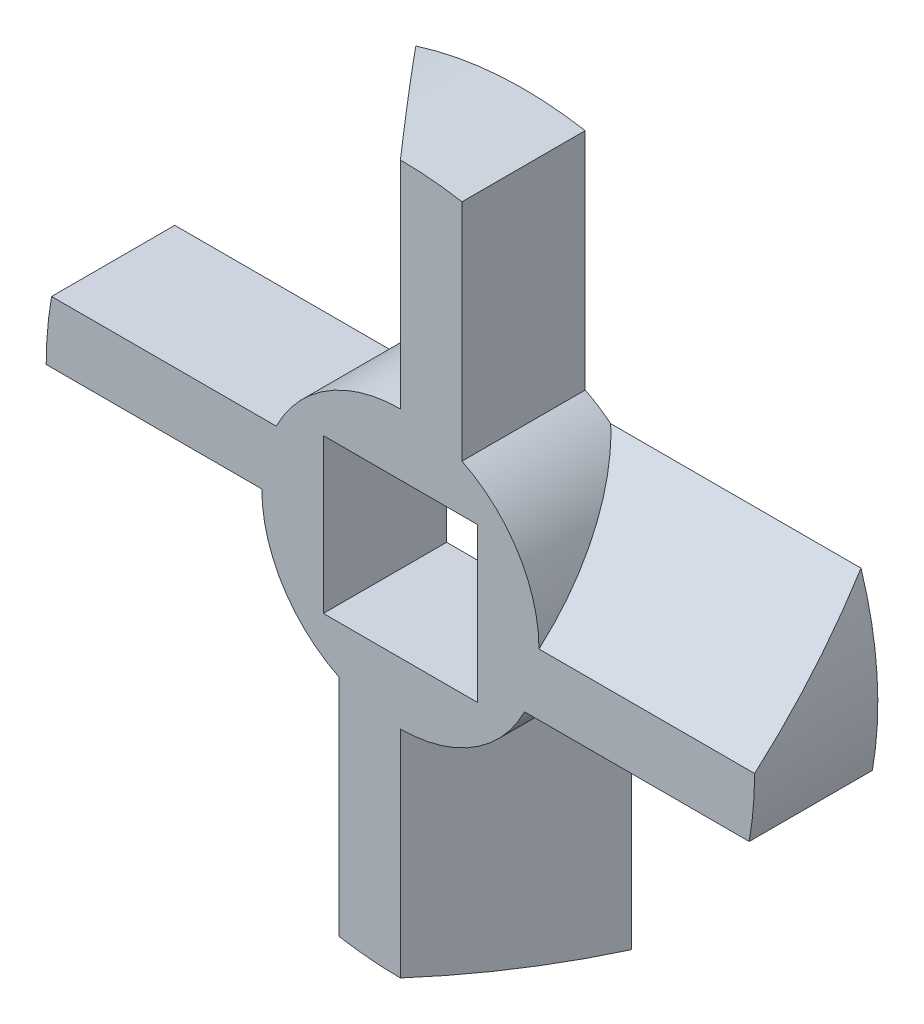
ISO-10303-21;
HEADER;
FILE_DESCRIPTION(('STEP AP214'),'2;1');
FILE_NAME('part.step','',(''),(''),'','','');
FILE_SCHEMA(('AUTOMOTIVE_DESIGN { 1 0 10303 214 1 1 1 1 }'));
ENDSEC;
DATA;
#1=APPLICATION_CONTEXT('core data for automotive mechanical design processes');
#2=APPLICATION_PROTOCOL_DEFINITION('international standard','automotive_design',2000,#1);
#3=PRODUCT_CONTEXT('',#1,'mechanical');
#4=PRODUCT('Part','Part','',(#3));
#5=PRODUCT_RELATED_PRODUCT_CATEGORY('part','',(#4));
#6=PRODUCT_DEFINITION_FORMATION('','',#4);
#7=PRODUCT_DEFINITION_CONTEXT('part definition',#1,'design');
#8=PRODUCT_DEFINITION('design','',#6,#7);
#9=PRODUCT_DEFINITION_SHAPE('','',#8);
#10=(LENGTH_UNIT() NAMED_UNIT(*) SI_UNIT(.MILLI.,.METRE.));
#11=(NAMED_UNIT(*) PLANE_ANGLE_UNIT() SI_UNIT($,.RADIAN.));
#12=(NAMED_UNIT(*) SI_UNIT($,.STERADIAN.) SOLID_ANGLE_UNIT());
#13=UNCERTAINTY_MEASURE_WITH_UNIT(LENGTH_MEASURE(1.E-05),#10,'distance_accuracy_value','');
#14=(GEOMETRIC_REPRESENTATION_CONTEXT(3) GLOBAL_UNCERTAINTY_ASSIGNED_CONTEXT((#13)) GLOBAL_UNIT_ASSIGNED_CONTEXT((#10,
#11,#12)) REPRESENTATION_CONTEXT('',''));
#15=CARTESIAN_POINT('',(0.,0.,0.));
#16=DIRECTION('',(0.,0.,1.));
#17=DIRECTION('',(1.,0.,0.));
#18=AXIS2_PLACEMENT_3D('',#15,#16,#17);
#19=CARTESIAN_POINT('',(0.,0.,0.));
#20=DIRECTION('',(0.,0.,1.));
#21=DIRECTION('',(1.,0.,0.));
#22=AXIS2_PLACEMENT_3D('',#19,#20,#21);
#23=PLANE('',#22);
#24=DIRECTION('',(0.,1.,0.));
#25=VECTOR('',#24,1.);
#26=CARTESIAN_POINT('',(5.,-5.,0.));
#27=LINE('',#26,#25);
#28=CARTESIAN_POINT('',(5.,-5.,0.));
#29=VERTEX_POINT('',#28);
#30=CARTESIAN_POINT('',(5.,5.,0.));
#31=VERTEX_POINT('',#30);
#32=EDGE_CURVE('E252',#29,#31,#27,.T.);
#33=ORIENTED_EDGE('',*,*,#32,.T.);
#34=DIRECTION('',(-1.,0.,0.));
#35=VECTOR('',#34,1.);
#36=CARTESIAN_POINT('',(-5.,5.,0.));
#37=LINE('',#36,#35);
#38=CARTESIAN_POINT('',(-5.,5.,0.));
#39=VERTEX_POINT('',#38);
#40=EDGE_CURVE('E285',#31,#39,#37,.T.);
#41=ORIENTED_EDGE('',*,*,#40,.T.);
#42=DIRECTION('',(0.,-1.,0.));
#43=VECTOR('',#42,1.);
#44=CARTESIAN_POINT('',(-5.,-5.,0.));
#45=LINE('',#44,#43);
#46=CARTESIAN_POINT('',(-5.,-5.,0.));
#47=VERTEX_POINT('',#46);
#48=EDGE_CURVE('E289',#39,#47,#45,.T.);
#49=ORIENTED_EDGE('',*,*,#48,.T.);
#50=DIRECTION('',(1.,0.,0.));
#51=VECTOR('',#50,1.);
#52=CARTESIAN_POINT('',(-5.,-5.,0.));
#53=LINE('',#52,#51);
#54=EDGE_CURVE('E271',#47,#29,#53,.T.);
#55=ORIENTED_EDGE('',*,*,#54,.T.);
#56=EDGE_LOOP('',(#33,#41,#49,#55));
#57=FACE_BOUND('',#56,.T.);
#58=DIRECTION('',(0.,-1.,0.));
#59=VECTOR('',#58,1.);
#60=CARTESIAN_POINT('',(7.,23.001,0.));
#61=LINE('',#60,#59);
#62=CARTESIAN_POINT('',(7.,-5.65685424949238,0.));
#63=VERTEX_POINT('',#62);
#64=CARTESIAN_POINT('',(7.,-21.9089023002066,0.));
#65=VERTEX_POINT('',#64);
#66=EDGE_CURVE('E390',#63,#65,#61,.T.);
#67=ORIENTED_EDGE('',*,*,#66,.T.);
#68=CARTESIAN_POINT('',(0.,0.,0.));
#69=DIRECTION('',(0.,0.,1.));
#70=DIRECTION('',(0.,1.,0.));
#71=AXIS2_PLACEMENT_3D('',#68,#69,#70);
#72=CIRCLE('',#71,23.);
#73=CARTESIAN_POINT('',(-4.,-22.6495033058122,0.));
#74=VERTEX_POINT('',#73);
#75=EDGE_CURVE('E70',#74,#65,#72,.T.);
#76=ORIENTED_EDGE('',*,*,#75,.F.);
#77=DIRECTION('',(0.,-1.,0.));
#78=VECTOR('',#77,1.);
#79=CARTESIAN_POINT('',(-4.,23.001,0.));
#80=LINE('',#79,#78);
#81=CARTESIAN_POINT('',(-4.,-8.06225774829855,0.));
#82=VERTEX_POINT('',#81);
#83=EDGE_CURVE('E368',#82,#74,#80,.T.);
#84=ORIENTED_EDGE('',*,*,#83,.F.);
#85=CARTESIAN_POINT('',(0.,0.,0.));
#86=DIRECTION('',(0.,0.,1.));
#87=DIRECTION('',(1.,0.,0.));
#88=AXIS2_PLACEMENT_3D('',#85,#86,#87);
#89=CIRCLE('',#88,9.);
#90=CARTESIAN_POINT('',(-5.65685424949236,-7.00000000000002,0.));
#91=VERTEX_POINT('',#90);
#92=EDGE_CURVE('E316',#91,#82,#89,.T.);
#93=ORIENTED_EDGE('',*,*,#92,.F.);
#94=DIRECTION('',(-1.,0.,0.));
#95=VECTOR('',#94,1.);
#96=CARTESIAN_POINT('',(9.00100000000011,-6.99999999999997,0.));
#97=LINE('',#96,#95);
#98=CARTESIAN_POINT('',(-21.9089023002066,-7.00000000000008,0.));
#99=VERTEX_POINT('',#98);
#100=EDGE_CURVE('E228',#91,#99,#97,.T.);
#101=ORIENTED_EDGE('',*,*,#100,.T.);
#102=CARTESIAN_POINT('',(-22.6495033058123,3.99999999999992,0.));
#103=VERTEX_POINT('',#102);
#104=EDGE_CURVE('E62',#103,#99,#72,.T.);
#105=ORIENTED_EDGE('',*,*,#104,.F.);
#106=DIRECTION('',(-1.,0.,0.));
#107=VECTOR('',#106,1.);
#108=CARTESIAN_POINT('',(9.00100000000007,4.00000000000003,0.));
#109=LINE('',#108,#107);
#110=CARTESIAN_POINT('',(-8.06225774829856,3.99999999999997,0.));
#111=VERTEX_POINT('',#110);
#112=EDGE_CURVE('E202',#111,#103,#109,.T.);
#113=ORIENTED_EDGE('',*,*,#112,.F.);
#114=CARTESIAN_POINT('',(-7.,5.65685424949238,0.));
#115=VERTEX_POINT('',#114);
#116=EDGE_CURVE('E314',#115,#111,#89,.T.);
#117=ORIENTED_EDGE('',*,*,#116,.F.);
#118=DIRECTION('',(0.,1.,0.));
#119=VECTOR('',#118,1.);
#120=CARTESIAN_POINT('',(-7.,-9.001,0.));
#121=LINE('',#120,#119);
#122=CARTESIAN_POINT('',(-7.,21.9089023002066,0.));
#123=VERTEX_POINT('',#122);
#124=EDGE_CURVE('E242',#115,#123,#121,.T.);
#125=ORIENTED_EDGE('',*,*,#124,.T.);
#126=CARTESIAN_POINT('',(0.,0.,0.));
#127=DIRECTION('',(0.,0.,1.));
#128=DIRECTION('',(1.,0.,0.));
#129=AXIS2_PLACEMENT_3D('',#126,#127,#128);
#130=CIRCLE('',#129,23.);
#131=CARTESIAN_POINT('',(4.,22.6495033058122,0.));
#132=VERTEX_POINT('',#131);
#133=EDGE_CURVE('E232',#132,#123,#130,.T.);
#134=ORIENTED_EDGE('',*,*,#133,.F.);
#135=DIRECTION('',(0.,1.,0.));
#136=VECTOR('',#135,1.);
#137=CARTESIAN_POINT('',(4.,-9.001,0.));
#138=LINE('',#137,#136);
#139=CARTESIAN_POINT('',(4.,8.06225774829855,0.));
#140=VERTEX_POINT('',#139);
#141=EDGE_CURVE('E247',#140,#132,#138,.T.);
#142=ORIENTED_EDGE('',*,*,#141,.F.);
#143=CARTESIAN_POINT('',(5.65685424949231,7.00000000000006,0.));
#144=VERTEX_POINT('',#143);
#145=EDGE_CURVE('E309',#144,#140,#89,.T.);
#146=ORIENTED_EDGE('',*,*,#145,.F.);
#147=DIRECTION('',(1.,0.,0.));
#148=VECTOR('',#147,1.);
#149=CARTESIAN_POINT('',(-9.00100000000017,6.9999999999999,0.));
#150=LINE('',#149,#148);
#151=CARTESIAN_POINT('',(21.9089023002066,7.00000000000023,0.));
#152=VERTEX_POINT('',#151);
#153=EDGE_CURVE('E204',#144,#152,#150,.T.);
#154=ORIENTED_EDGE('',*,*,#153,.T.);
#155=CARTESIAN_POINT('',(22.6495033058123,-3.99999999999976,0.));
#156=VERTEX_POINT('',#155);
#157=EDGE_CURVE('E398',#156,#152,#72,.T.);
#158=ORIENTED_EDGE('',*,*,#157,.F.);
#159=DIRECTION('',(1.,0.,0.));
#160=VECTOR('',#159,1.);
#161=CARTESIAN_POINT('',(-9.00100000000006,-4.0000000000001,0.));
#162=LINE('',#161,#160);
#163=CARTESIAN_POINT('',(8.06225774829859,-3.99999999999992,0.));
#164=VERTEX_POINT('',#163);
#165=EDGE_CURVE('E372',#164,#156,#162,.T.);
#166=ORIENTED_EDGE('',*,*,#165,.F.);
#167=EDGE_CURVE('E342',#63,#164,#89,.T.);
#168=ORIENTED_EDGE('',*,*,#167,.F.);
#169=EDGE_LOOP('',(#67,#76,#84,#93,#101,#105,#113,#117,#125,#134,#142,#146,#154,#158,#166,#168));
#170=FACE_BOUND('',#169,.T.);
#171=ADVANCED_FACE('F46',(#57,#170),#23,.F.);
#172=CARTESIAN_POINT('',(9.00100000000011,-6.99999999999997,0.));
#173=DIRECTION('',(0.,-0.752576694706878,0.658504607868518));
#174=DIRECTION('',(0.,-0.658504607868518,-0.752576694706878));
#175=AXIS2_PLACEMENT_3D('',#172,#173,#174);
#176=PLANE('',#175);
#177=CARTESIAN_POINT('',(0.,0.,8.));
#178=DIRECTION('',(0.,-0.752576694706878,0.658504607868518));
#179=DIRECTION('',(0.,-0.658504607868518,-0.752576694706878));
#180=AXIS2_PLACEMENT_3D('',#177,#178,#179);
#181=ELLIPSE('',#180,34.9276219561281,23.);
#182=CARTESIAN_POINT('',(-23.,0.,8.));
#183=VERTEX_POINT('',#182);
#184=EDGE_CURVE('E185',#99,#183,#181,.F.);
#185=ORIENTED_EDGE('',*,*,#184,.F.);
#186=ORIENTED_EDGE('',*,*,#100,.F.);
#187=CARTESIAN_POINT('',(0.,0.,8.));
#188=DIRECTION('',(0.,-0.752576694706878,0.658504607868518));
#189=DIRECTION('',(0.,-0.658504607868518,-0.752576694706878));
#190=AXIS2_PLACEMENT_3D('',#187,#188,#189);
#191=ELLIPSE('',#190,13.6673303306588,9.);
#192=CARTESIAN_POINT('',(-9.,0.,8.));
#193=VERTEX_POINT('',#192);
#194=EDGE_CURVE('E213',#91,#193,#191,.F.);
#195=ORIENTED_EDGE('',*,*,#194,.T.);
#196=DIRECTION('',(-1.,0.,0.));
#197=VECTOR('',#196,1.);
#198=CARTESIAN_POINT('',(9.00100000000008,0.,8.));
#199=LINE('',#198,#197);
#200=EDGE_CURVE('E220',#193,#183,#199,.T.);
#201=ORIENTED_EDGE('',*,*,#200,.T.);
#202=EDGE_LOOP('',(#185,#186,#195,#201));
#203=FACE_BOUND('',#202,.T.);
#204=ADVANCED_FACE('F474',(#203),#176,.T.);
#205=CARTESIAN_POINT('',(7.,23.001,0.));
#206=DIRECTION('',(0.752576694706878,0.,0.658504607868518));
#207=DIRECTION('',(0.658504607868518,0.,-0.752576694706878));
#208=AXIS2_PLACEMENT_3D('',#205,#206,#207);
#209=PLANE('',#208);
#210=CARTESIAN_POINT('',(0.,0.,8.));
#211=DIRECTION('',(0.752576694706878,0.,0.658504607868518));
#212=DIRECTION('',(0.658504607868518,0.,-0.752576694706878));
#213=AXIS2_PLACEMENT_3D('',#210,#211,#212);
#214=ELLIPSE('',#213,34.9276219561281,23.);
#215=CARTESIAN_POINT('',(0.,-23.,8.));
#216=VERTEX_POINT('',#215);
#217=EDGE_CURVE('E419',#65,#216,#214,.F.);
#218=ORIENTED_EDGE('',*,*,#217,.F.);
#219=ORIENTED_EDGE('',*,*,#66,.F.);
#220=CARTESIAN_POINT('',(0.,0.,8.));
#221=DIRECTION('',(0.752576694706878,0.,0.658504607868518));
#222=DIRECTION('',(0.658504607868518,0.,-0.752576694706878));
#223=AXIS2_PLACEMENT_3D('',#220,#221,#222);
#224=ELLIPSE('',#223,13.6673303306588,9.);
#225=CARTESIAN_POINT('',(0.,-9.,8.));
#226=VERTEX_POINT('',#225);
#227=EDGE_CURVE('E379',#63,#226,#224,.F.);
#228=ORIENTED_EDGE('',*,*,#227,.T.);
#229=DIRECTION('',(0.,-1.,0.));
#230=VECTOR('',#229,1.);
#231=CARTESIAN_POINT('',(0.,23.001,8.));
#232=LINE('',#231,#230);
#233=EDGE_CURVE('E386',#226,#216,#232,.T.);
#234=ORIENTED_EDGE('',*,*,#233,.T.);
#235=EDGE_LOOP('',(#218,#219,#228,#234));
#236=FACE_BOUND('',#235,.T.);
#237=ADVANCED_FACE('F452',(#236),#209,.T.);
#238=CARTESIAN_POINT('',(-9.00100000000017,6.9999999999999,0.));
#239=DIRECTION('',(0.,0.752576694706878,0.658504607868518));
#240=DIRECTION('',(0.,-0.658504607868518,0.752576694706878));
#241=AXIS2_PLACEMENT_3D('',#238,#239,#240);
#242=PLANE('',#241);
#243=CARTESIAN_POINT('',(0.,0.,8.));
#244=DIRECTION('',(0.,0.752576694706878,0.658504607868518));
#245=DIRECTION('',(0.,0.658504607868518,-0.752576694706878));
#246=AXIS2_PLACEMENT_3D('',#243,#244,#245);
#247=ELLIPSE('',#246,34.9276219561281,23.);
#248=CARTESIAN_POINT('',(23.,2.40912212380176E-13,8.));
#249=VERTEX_POINT('',#248);
#250=EDGE_CURVE('E191',#152,#249,#247,.F.);
#251=ORIENTED_EDGE('',*,*,#250,.F.);
#252=ORIENTED_EDGE('',*,*,#153,.F.);
#253=CARTESIAN_POINT('',(0.,0.,8.));
#254=DIRECTION('',(0.,0.752576694706878,0.658504607868518));
#255=DIRECTION('',(0.,0.658504607868518,-0.752576694706878));
#256=AXIS2_PLACEMENT_3D('',#253,#254,#255);
#257=ELLIPSE('',#256,13.6673303306588,9.);
#258=CARTESIAN_POINT('',(9.,0.,8.));
#259=VERTEX_POINT('',#258);
#260=EDGE_CURVE('E339',#144,#259,#257,.F.);
#261=ORIENTED_EDGE('',*,*,#260,.T.);
#262=DIRECTION('',(1.,0.,0.));
#263=VECTOR('',#262,1.);
#264=CARTESIAN_POINT('',(-9.0010000000001,0.,8.));
#265=LINE('',#264,#263);
#266=EDGE_CURVE('E417',#259,#249,#265,.T.);
#267=ORIENTED_EDGE('',*,*,#266,.T.);
#268=EDGE_LOOP('',(#251,#252,#261,#267));
#269=FACE_BOUND('',#268,.T.);
#270=ADVANCED_FACE('F416',(#269),#242,.T.);
#271=CARTESIAN_POINT('',(0.,0.,8.));
#272=DIRECTION('',(0.,0.,-1.));
#273=DIRECTION('',(-1.,0.,0.));
#274=AXIS2_PLACEMENT_3D('',#271,#272,#273);
#275=CYLINDRICAL_SURFACE('',#274,9.);
#276=CARTESIAN_POINT('',(0.,0.,8.));
#277=DIRECTION('',(0.,0.,1.));
#278=DIRECTION('',(1.,0.,0.));
#279=AXIS2_PLACEMENT_3D('',#276,#277,#278);
#280=CIRCLE('',#279,9.);
#281=CARTESIAN_POINT('',(4.,8.06225774829855,8.));
#282=VERTEX_POINT('',#281);
#283=EDGE_CURVE('E313',#259,#282,#280,.T.);
#284=ORIENTED_EDGE('',*,*,#283,.F.);
#285=ORIENTED_EDGE('',*,*,#260,.F.);
#286=ORIENTED_EDGE('',*,*,#145,.T.);
#287=DIRECTION('',(0.,0.,-1.));
#288=VECTOR('',#287,1.);
#289=CARTESIAN_POINT('',(4.,8.06225774829855,8.));
#290=LINE('',#289,#288);
#291=EDGE_CURVE('E243',#282,#140,#290,.T.);
#292=ORIENTED_EDGE('',*,*,#291,.F.);
#293=EDGE_LOOP('',(#284,#285,#286,#292));
#294=FACE_BOUND('',#293,.T.);
#295=ADVANCED_FACE('F336',(#294),#275,.T.);
#296=ORIENTED_EDGE('',*,*,#92,.T.);
#297=DIRECTION('',(0.,0.,-1.));
#298=VECTOR('',#297,1.);
#299=CARTESIAN_POINT('',(-4.,-8.06225774829855,8.));
#300=LINE('',#299,#298);
#301=CARTESIAN_POINT('',(-4.,-8.06225774829855,8.));
#302=VERTEX_POINT('',#301);
#303=EDGE_CURVE('E359',#302,#82,#300,.T.);
#304=ORIENTED_EDGE('',*,*,#303,.F.);
#305=EDGE_CURVE('E312',#193,#302,#280,.T.);
#306=ORIENTED_EDGE('',*,*,#305,.F.);
#307=ORIENTED_EDGE('',*,*,#194,.F.);
#308=EDGE_LOOP('',(#296,#304,#306,#307));
#309=FACE_BOUND('',#308,.T.);
#310=ADVANCED_FACE('F358',(#309),#275,.T.);
#311=ORIENTED_EDGE('',*,*,#116,.T.);
#312=DIRECTION('',(0.,0.,-1.));
#313=VECTOR('',#312,1.);
#314=CARTESIAN_POINT('',(-8.06225774829856,3.99999999999997,8.));
#315=LINE('',#314,#313);
#316=CARTESIAN_POINT('',(-8.06225774829856,3.99999999999997,8.));
#317=VERTEX_POINT('',#316);
#318=EDGE_CURVE('E222',#317,#111,#315,.T.);
#319=ORIENTED_EDGE('',*,*,#318,.F.);
#320=CARTESIAN_POINT('',(0.,9.,8.));
#321=VERTEX_POINT('',#320);
#322=EDGE_CURVE('E211',#321,#317,#280,.T.);
#323=ORIENTED_EDGE('',*,*,#322,.F.);
#324=CARTESIAN_POINT('',(0.,0.,8.));
#325=DIRECTION('',(-0.752576694706878,0.,0.658504607868518));
#326=DIRECTION('',(-0.658504607868518,0.,-0.752576694706878));
#327=AXIS2_PLACEMENT_3D('',#324,#325,#326);
#328=ELLIPSE('',#327,13.6673303306588,9.);
#329=EDGE_CURVE('E260',#115,#321,#328,.F.);
#330=ORIENTED_EDGE('',*,*,#329,.F.);
#331=EDGE_LOOP('',(#311,#319,#323,#330));
#332=FACE_BOUND('',#331,.T.);
#333=ADVANCED_FACE('F485',(#332),#275,.T.);
#334=CARTESIAN_POINT('',(0.,0.,8.));
#335=DIRECTION('',(0.,0.,1.));
#336=DIRECTION('',(1.,0.,0.));
#337=AXIS2_PLACEMENT_3D('',#334,#335,#336);
#338=PLANE('',#337);
#339=CARTESIAN_POINT('',(0.,0.,8.));
#340=DIRECTION('',(0.,0.,1.));
#341=DIRECTION('',(0.,1.,0.));
#342=AXIS2_PLACEMENT_3D('',#339,#340,#341);
#343=CIRCLE('',#342,23.);
#344=CARTESIAN_POINT('',(22.6495033058123,-3.99999999999976,8.));
#345=VERTEX_POINT('',#344);
#346=EDGE_CURVE('E194',#345,#249,#343,.T.);
#347=ORIENTED_EDGE('',*,*,#346,.T.);
#348=ORIENTED_EDGE('',*,*,#266,.F.);
#349=ORIENTED_EDGE('',*,*,#283,.T.);
#350=DIRECTION('',(0.,1.,0.));
#351=VECTOR('',#350,1.);
#352=CARTESIAN_POINT('',(4.,-9.001,8.));
#353=LINE('',#352,#351);
#354=CARTESIAN_POINT('',(4.,22.6495033058122,8.));
#355=VERTEX_POINT('',#354);
#356=EDGE_CURVE('E248',#282,#355,#353,.T.);
#357=ORIENTED_EDGE('',*,*,#356,.T.);
#358=CARTESIAN_POINT('',(0.,0.,8.));
#359=DIRECTION('',(0.,0.,1.));
#360=DIRECTION('',(1.,0.,0.));
#361=AXIS2_PLACEMENT_3D('',#358,#359,#360);
#362=CIRCLE('',#361,23.);
#363=CARTESIAN_POINT('',(0.,23.,8.));
#364=VERTEX_POINT('',#363);
#365=EDGE_CURVE('E233',#355,#364,#362,.T.);
#366=ORIENTED_EDGE('',*,*,#365,.T.);
#367=DIRECTION('',(0.,1.,0.));
#368=VECTOR('',#367,1.);
#369=CARTESIAN_POINT('',(0.,-9.001,8.));
#370=LINE('',#369,#368);
#371=EDGE_CURVE('E256',#321,#364,#370,.T.);
#372=ORIENTED_EDGE('',*,*,#371,.F.);
#373=ORIENTED_EDGE('',*,*,#322,.T.);
#374=DIRECTION('',(-1.,0.,0.));
#375=VECTOR('',#374,1.);
#376=CARTESIAN_POINT('',(9.00100000000007,4.00000000000003,8.));
#377=LINE('',#376,#375);
#378=CARTESIAN_POINT('',(-22.6495033058123,3.99999999999992,8.));
#379=VERTEX_POINT('',#378);
#380=EDGE_CURVE('E200',#317,#379,#377,.T.);
#381=ORIENTED_EDGE('',*,*,#380,.T.);
#382=EDGE_CURVE('E181',#379,#183,#343,.T.);
#383=ORIENTED_EDGE('',*,*,#382,.T.);
#384=ORIENTED_EDGE('',*,*,#200,.F.);
#385=ORIENTED_EDGE('',*,*,#305,.T.);
#386=DIRECTION('',(0.,-1.,0.));
#387=VECTOR('',#386,1.);
#388=CARTESIAN_POINT('',(-4.,23.001,8.));
#389=LINE('',#388,#387);
#390=CARTESIAN_POINT('',(-4.,-22.6495033058122,8.));
#391=VERTEX_POINT('',#390);
#392=EDGE_CURVE('E370',#302,#391,#389,.T.);
#393=ORIENTED_EDGE('',*,*,#392,.T.);
#394=EDGE_CURVE('E192',#391,#216,#343,.T.);
#395=ORIENTED_EDGE('',*,*,#394,.T.);
#396=ORIENTED_EDGE('',*,*,#233,.F.);
#397=CARTESIAN_POINT('',(8.06225774829859,-3.99999999999992,8.));
#398=VERTEX_POINT('',#397);
#399=EDGE_CURVE('E453',#226,#398,#280,.T.);
#400=ORIENTED_EDGE('',*,*,#399,.T.);
#401=DIRECTION('',(1.,0.,0.));
#402=VECTOR('',#401,1.);
#403=CARTESIAN_POINT('',(-9.00100000000006,-4.0000000000001,8.));
#404=LINE('',#403,#402);
#405=EDGE_CURVE('E428',#398,#345,#404,.T.);
#406=ORIENTED_EDGE('',*,*,#405,.T.);
#407=EDGE_LOOP('',(#347,#348,#349,#357,#366,#372,#373,#381,#383,#384,#385,#393,#395,#396,#400,#406));
#408=FACE_BOUND('',#407,.T.);
#409=DIRECTION('',(-1.,0.,0.));
#410=VECTOR('',#409,1.);
#411=CARTESIAN_POINT('',(-5.,5.,8.));
#412=LINE('',#411,#410);
#413=CARTESIAN_POINT('',(5.,5.,8.));
#414=VERTEX_POINT('',#413);
#415=CARTESIAN_POINT('',(-5.,5.,8.));
#416=VERTEX_POINT('',#415);
#417=EDGE_CURVE('E270',#414,#416,#412,.T.);
#418=ORIENTED_EDGE('',*,*,#417,.F.);
#419=DIRECTION('',(0.,1.,0.));
#420=VECTOR('',#419,1.);
#421=CARTESIAN_POINT('',(5.,-5.,8.));
#422=LINE('',#421,#420);
#423=CARTESIAN_POINT('',(5.,-5.,8.));
#424=VERTEX_POINT('',#423);
#425=EDGE_CURVE('E267',#424,#414,#422,.T.);
#426=ORIENTED_EDGE('',*,*,#425,.F.);
#427=DIRECTION('',(1.,0.,0.));
#428=VECTOR('',#427,1.);
#429=CARTESIAN_POINT('',(-5.,-5.,8.));
#430=LINE('',#429,#428);
#431=CARTESIAN_POINT('',(-5.,-5.,8.));
#432=VERTEX_POINT('',#431);
#433=EDGE_CURVE('E278',#432,#424,#430,.T.);
#434=ORIENTED_EDGE('',*,*,#433,.F.);
#435=DIRECTION('',(0.,-1.,0.));
#436=VECTOR('',#435,1.);
#437=CARTESIAN_POINT('',(-5.,-5.,8.));
#438=LINE('',#437,#436);
#439=EDGE_CURVE('E274',#416,#432,#438,.T.);
#440=ORIENTED_EDGE('',*,*,#439,.F.);
#441=EDGE_LOOP('',(#418,#426,#434,#440));
#442=FACE_BOUND('',#441,.T.);
#443=ADVANCED_FACE('F208',(#408,#442),#338,.T.);
#444=CARTESIAN_POINT('',(-7.,-9.001,0.));
#445=DIRECTION('',(-0.752576694706878,0.,0.658504607868518));
#446=DIRECTION('',(0.658504607868518,0.,0.752576694706878));
#447=AXIS2_PLACEMENT_3D('',#444,#445,#446);
#448=PLANE('',#447);
#449=CARTESIAN_POINT('',(0.,0.,8.));
#450=DIRECTION('',(-0.752576694706878,0.,0.658504607868518));
#451=DIRECTION('',(-0.658504607868518,0.,-0.752576694706878));
#452=AXIS2_PLACEMENT_3D('',#449,#450,#451);
#453=ELLIPSE('',#452,34.9276219561281,23.);
#454=EDGE_CURVE('E237',#123,#364,#453,.F.);
#455=ORIENTED_EDGE('',*,*,#454,.F.);
#456=ORIENTED_EDGE('',*,*,#124,.F.);
#457=ORIENTED_EDGE('',*,*,#329,.T.);
#458=ORIENTED_EDGE('',*,*,#371,.T.);
#459=EDGE_LOOP('',(#455,#456,#457,#458));
#460=FACE_BOUND('',#459,.T.);
#461=ADVANCED_FACE('F484',(#460),#448,.T.);
#462=ORIENTED_EDGE('',*,*,#167,.T.);
#463=DIRECTION('',(0.,0.,-1.));
#464=VECTOR('',#463,1.);
#465=CARTESIAN_POINT('',(8.06225774829859,-3.99999999999992,8.));
#466=LINE('',#465,#464);
#467=EDGE_CURVE('E432',#398,#164,#466,.T.);
#468=ORIENTED_EDGE('',*,*,#467,.F.);
#469=ORIENTED_EDGE('',*,*,#399,.F.);
#470=ORIENTED_EDGE('',*,*,#227,.F.);
#471=EDGE_LOOP('',(#462,#468,#469,#470));
#472=FACE_BOUND('',#471,.T.);
#473=ADVANCED_FACE('F48',(#472),#275,.T.);
#474=CARTESIAN_POINT('',(5.,-5.,8.));
#475=DIRECTION('',(-1.,0.,0.));
#476=DIRECTION('',(0.,0.,1.));
#477=AXIS2_PLACEMENT_3D('',#474,#475,#476);
#478=PLANE('',#477);
#479=ORIENTED_EDGE('',*,*,#32,.F.);
#480=DIRECTION('',(0.,0.,-1.));
#481=VECTOR('',#480,1.);
#482=CARTESIAN_POINT('',(5.,-5.,8.));
#483=LINE('',#482,#481);
#484=EDGE_CURVE('E281',#424,#29,#483,.T.);
#485=ORIENTED_EDGE('',*,*,#484,.F.);
#486=ORIENTED_EDGE('',*,*,#425,.T.);
#487=DIRECTION('',(0.,0.,-1.));
#488=VECTOR('',#487,1.);
#489=CARTESIAN_POINT('',(5.,5.,8.));
#490=LINE('',#489,#488);
#491=EDGE_CURVE('E305',#414,#31,#490,.T.);
#492=ORIENTED_EDGE('',*,*,#491,.T.);
#493=EDGE_LOOP('',(#479,#485,#486,#492));
#494=FACE_BOUND('',#493,.T.);
#495=ADVANCED_FACE('F486',(#494),#478,.T.);
#496=CARTESIAN_POINT('',(-5.,5.,8.));
#497=DIRECTION('',(0.,-1.,0.));
#498=DIRECTION('',(0.,0.,-1.));
#499=AXIS2_PLACEMENT_3D('',#496,#497,#498);
#500=PLANE('',#499);
#501=ORIENTED_EDGE('',*,*,#40,.F.);
#502=ORIENTED_EDGE('',*,*,#491,.F.);
#503=ORIENTED_EDGE('',*,*,#417,.T.);
#504=DIRECTION('',(0.,0.,-1.));
#505=VECTOR('',#504,1.);
#506=CARTESIAN_POINT('',(-5.,5.,8.));
#507=LINE('',#506,#505);
#508=EDGE_CURVE('E302',#416,#39,#507,.T.);
#509=ORIENTED_EDGE('',*,*,#508,.T.);
#510=EDGE_LOOP('',(#501,#502,#503,#509));
#511=FACE_BOUND('',#510,.T.);
#512=ADVANCED_FACE('F489',(#511),#500,.T.);
#513=CARTESIAN_POINT('',(-5.,-5.,8.));
#514=DIRECTION('',(1.,0.,0.));
#515=DIRECTION('',(0.,0.,-1.));
#516=AXIS2_PLACEMENT_3D('',#513,#514,#515);
#517=PLANE('',#516);
#518=ORIENTED_EDGE('',*,*,#48,.F.);
#519=ORIENTED_EDGE('',*,*,#508,.F.);
#520=ORIENTED_EDGE('',*,*,#439,.T.);
#521=DIRECTION('',(0.,0.,-1.));
#522=VECTOR('',#521,1.);
#523=CARTESIAN_POINT('',(-5.,-5.,8.));
#524=LINE('',#523,#522);
#525=EDGE_CURVE('E299',#432,#47,#524,.T.);
#526=ORIENTED_EDGE('',*,*,#525,.T.);
#527=EDGE_LOOP('',(#518,#519,#520,#526));
#528=FACE_BOUND('',#527,.T.);
#529=ADVANCED_FACE('F493',(#528),#517,.T.);
#530=CARTESIAN_POINT('',(-5.,-5.,8.));
#531=DIRECTION('',(0.,1.,0.));
#532=DIRECTION('',(0.,0.,1.));
#533=AXIS2_PLACEMENT_3D('',#530,#531,#532);
#534=PLANE('',#533);
#535=ORIENTED_EDGE('',*,*,#54,.F.);
#536=ORIENTED_EDGE('',*,*,#525,.F.);
#537=ORIENTED_EDGE('',*,*,#433,.T.);
#538=ORIENTED_EDGE('',*,*,#484,.T.);
#539=EDGE_LOOP('',(#535,#536,#537,#538));
#540=FACE_BOUND('',#539,.T.);
#541=ADVANCED_FACE('F497',(#540),#534,.T.);
#542=CARTESIAN_POINT('',(4.,-9.001,8.));
#543=DIRECTION('',(1.,0.,0.));
#544=DIRECTION('',(0.,0.,-1.));
#545=AXIS2_PLACEMENT_3D('',#542,#543,#544);
#546=PLANE('',#545);
#547=DIRECTION('',(0.,0.,-1.));
#548=VECTOR('',#547,1.);
#549=CARTESIAN_POINT('',(4.,22.6495033058122,8.));
#550=LINE('',#549,#548);
#551=EDGE_CURVE('E55',#355,#132,#550,.T.);
#552=ORIENTED_EDGE('',*,*,#551,.F.);
#553=ORIENTED_EDGE('',*,*,#356,.F.);
#554=ORIENTED_EDGE('',*,*,#291,.T.);
#555=ORIENTED_EDGE('',*,*,#141,.T.);
#556=EDGE_LOOP('',(#552,#553,#554,#555));
#557=FACE_BOUND('',#556,.T.);
#558=ADVANCED_FACE('F332',(#557),#546,.T.);
#559=CARTESIAN_POINT('',(0.,0.,8.));
#560=DIRECTION('',(0.,0.,-1.));
#561=DIRECTION('',(-1.,0.,0.));
#562=AXIS2_PLACEMENT_3D('',#559,#560,#561);
#563=CYLINDRICAL_SURFACE('',#562,23.);
#564=ORIENTED_EDGE('',*,*,#454,.T.);
#565=ORIENTED_EDGE('',*,*,#365,.F.);
#566=ORIENTED_EDGE('',*,*,#551,.T.);
#567=ORIENTED_EDGE('',*,*,#133,.T.);
#568=EDGE_LOOP('',(#564,#565,#566,#567));
#569=FACE_BOUND('',#568,.T.);
#570=ADVANCED_FACE('F323',(#569),#563,.T.);
#571=CARTESIAN_POINT('',(9.00100000000007,4.00000000000003,8.));
#572=DIRECTION('',(0.,1.,0.));
#573=DIRECTION('',(-1.,0.,0.));
#574=AXIS2_PLACEMENT_3D('',#571,#572,#573);
#575=PLANE('',#574);
#576=DIRECTION('',(0.,0.,-1.));
#577=VECTOR('',#576,1.);
#578=CARTESIAN_POINT('',(-22.6495033058123,3.99999999999992,8.));
#579=LINE('',#578,#577);
#580=EDGE_CURVE('E184',#379,#103,#579,.T.);
#581=ORIENTED_EDGE('',*,*,#580,.F.);
#582=ORIENTED_EDGE('',*,*,#380,.F.);
#583=ORIENTED_EDGE('',*,*,#318,.T.);
#584=ORIENTED_EDGE('',*,*,#112,.T.);
#585=EDGE_LOOP('',(#581,#582,#583,#584));
#586=FACE_BOUND('',#585,.T.);
#587=ADVANCED_FACE('F198',(#586),#575,.T.);
#588=CARTESIAN_POINT('',(-4.,23.001,8.));
#589=DIRECTION('',(-1.,0.,0.));
#590=DIRECTION('',(0.,0.,1.));
#591=AXIS2_PLACEMENT_3D('',#588,#589,#590);
#592=PLANE('',#591);
#593=DIRECTION('',(0.,0.,-1.));
#594=VECTOR('',#593,1.);
#595=CARTESIAN_POINT('',(-4.,-22.6495033058122,8.));
#596=LINE('',#595,#594);
#597=EDGE_CURVE('E439',#391,#74,#596,.T.);
#598=ORIENTED_EDGE('',*,*,#597,.F.);
#599=ORIENTED_EDGE('',*,*,#392,.F.);
#600=ORIENTED_EDGE('',*,*,#303,.T.);
#601=ORIENTED_EDGE('',*,*,#83,.T.);
#602=EDGE_LOOP('',(#598,#599,#600,#601));
#603=FACE_BOUND('',#602,.T.);
#604=ADVANCED_FACE('F367',(#603),#592,.T.);
#605=CARTESIAN_POINT('',(-9.00100000000006,-4.0000000000001,8.));
#606=DIRECTION('',(0.,-1.,0.));
#607=DIRECTION('',(1.,0.,0.));
#608=AXIS2_PLACEMENT_3D('',#605,#606,#607);
#609=PLANE('',#608);
#610=DIRECTION('',(0.,0.,-1.));
#611=VECTOR('',#610,1.);
#612=CARTESIAN_POINT('',(22.6495033058123,-3.99999999999976,8.));
#613=LINE('',#612,#611);
#614=EDGE_CURVE('E12',#345,#156,#613,.T.);
#615=ORIENTED_EDGE('',*,*,#614,.F.);
#616=ORIENTED_EDGE('',*,*,#405,.F.);
#617=ORIENTED_EDGE('',*,*,#467,.T.);
#618=ORIENTED_EDGE('',*,*,#165,.T.);
#619=EDGE_LOOP('',(#615,#616,#617,#618));
#620=FACE_BOUND('',#619,.T.);
#621=ADVANCED_FACE('F462',(#620),#609,.T.);
#622=CARTESIAN_POINT('',(0.,0.,8.));
#623=DIRECTION('',(0.,0.,-1.));
#624=DIRECTION('',(-1.,0.,0.));
#625=AXIS2_PLACEMENT_3D('',#622,#623,#624);
#626=CYLINDRICAL_SURFACE('',#625,23.);
#627=ORIENTED_EDGE('',*,*,#250,.T.);
#628=ORIENTED_EDGE('',*,*,#346,.F.);
#629=ORIENTED_EDGE('',*,*,#614,.T.);
#630=ORIENTED_EDGE('',*,*,#157,.T.);
#631=EDGE_LOOP('',(#627,#628,#629,#630));
#632=FACE_BOUND('',#631,.T.);
#633=ADVANCED_FACE('F410',(#632),#626,.T.);
#634=ORIENTED_EDGE('',*,*,#597,.T.);
#635=ORIENTED_EDGE('',*,*,#75,.T.);
#636=ORIENTED_EDGE('',*,*,#217,.T.);
#637=ORIENTED_EDGE('',*,*,#394,.F.);
#638=EDGE_LOOP('',(#634,#635,#636,#637));
#639=FACE_BOUND('',#638,.T.);
#640=ADVANCED_FACE('F446',(#639),#626,.T.);
#641=ORIENTED_EDGE('',*,*,#580,.T.);
#642=ORIENTED_EDGE('',*,*,#104,.T.);
#643=ORIENTED_EDGE('',*,*,#184,.T.);
#644=ORIENTED_EDGE('',*,*,#382,.F.);
#645=EDGE_LOOP('',(#641,#642,#643,#644));
#646=FACE_BOUND('',#645,.T.);
#647=ADVANCED_FACE('F183',(#646),#626,.T.);
#648=CLOSED_SHELL('',(#171,#204,#237,#270,#295,#310,#333,#443,#461,#473,#495,#512,#529,#541,
#558,#570,#587,#604,#621,#633,#640,#647));
#649=MANIFOLD_SOLID_BREP('B2',#648);
#650=ADVANCED_BREP_SHAPE_REPRESENTATION('',(#18,#649),#14);
#651=SHAPE_DEFINITION_REPRESENTATION(#9,#650);
ENDSEC;
END-ISO-10303-21;
